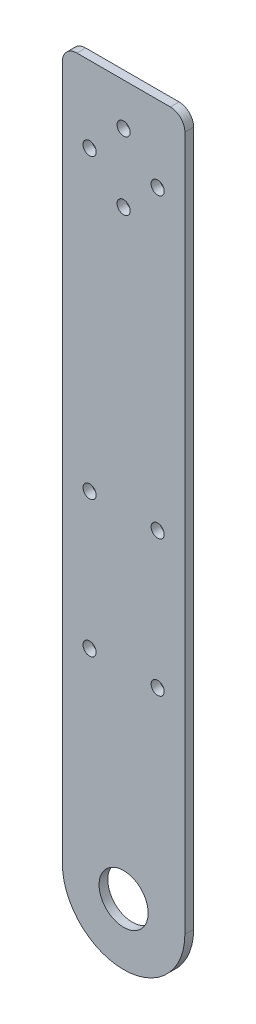
ISO-10303-21;
HEADER;
FILE_DESCRIPTION(('STEP AP214'),'2;1');
FILE_NAME('part.step','',(''),(''),'','','');
FILE_SCHEMA(('AUTOMOTIVE_DESIGN { 1 0 10303 214 1 1 1 1 }'));
ENDSEC;
DATA;
#1=APPLICATION_CONTEXT('core data for automotive mechanical design processes');
#2=APPLICATION_PROTOCOL_DEFINITION('international standard','automotive_design',2000,#1);
#3=PRODUCT_CONTEXT('',#1,'mechanical');
#4=PRODUCT('Part','Part','',(#3));
#5=PRODUCT_RELATED_PRODUCT_CATEGORY('part','',(#4));
#6=PRODUCT_DEFINITION_FORMATION('','',#4);
#7=PRODUCT_DEFINITION_CONTEXT('part definition',#1,'design');
#8=PRODUCT_DEFINITION('design','',#6,#7);
#9=PRODUCT_DEFINITION_SHAPE('','',#8);
#10=(LENGTH_UNIT() NAMED_UNIT(*) SI_UNIT(.MILLI.,.METRE.));
#11=(NAMED_UNIT(*) PLANE_ANGLE_UNIT() SI_UNIT($,.RADIAN.));
#12=(NAMED_UNIT(*) SI_UNIT($,.STERADIAN.) SOLID_ANGLE_UNIT());
#13=UNCERTAINTY_MEASURE_WITH_UNIT(LENGTH_MEASURE(1.E-05),#10,'distance_accuracy_value','');
#14=(GEOMETRIC_REPRESENTATION_CONTEXT(3) GLOBAL_UNCERTAINTY_ASSIGNED_CONTEXT((#13)) GLOBAL_UNIT_ASSIGNED_CONTEXT((#10,
#11,#12)) REPRESENTATION_CONTEXT('',''));
#15=CARTESIAN_POINT('',(0.,0.,0.));
#16=DIRECTION('',(0.,0.,1.));
#17=DIRECTION('',(1.,0.,0.));
#18=AXIS2_PLACEMENT_3D('',#15,#16,#17);
#19=CARTESIAN_POINT('',(0.,0.,1.8));
#20=DIRECTION('',(0.,0.,1.));
#21=DIRECTION('',(1.,0.,0.));
#22=AXIS2_PLACEMENT_3D('',#19,#20,#21);
#23=PLANE('',#22);
#24=CARTESIAN_POINT('',(0.,123.185826180637,1.8));
#25=DIRECTION('',(0.,0.,1.));
#26=DIRECTION('',(-1.,0.,0.));
#27=AXIS2_PLACEMENT_3D('',#24,#25,#26);
#28=CIRCLE('',#27,1.35);
#29=CARTESIAN_POINT('',(-1.35,123.185826180637,1.8));
#30=VERTEX_POINT('',#29);
#31=EDGE_CURVE('E218',#30,#30,#28,.T.);
#32=ORIENTED_EDGE('',*,*,#31,.F.);
#33=EDGE_LOOP('',(#32));
#34=FACE_BOUND('',#33,.T.);
#35=CARTESIAN_POINT('',(0.,137.185826180637,1.8));
#36=DIRECTION('',(0.,0.,1.));
#37=DIRECTION('',(1.,0.,0.));
#38=AXIS2_PLACEMENT_3D('',#35,#36,#37);
#39=CIRCLE('',#38,1.35);
#40=CARTESIAN_POINT('',(1.35,137.185826180637,1.8));
#41=VERTEX_POINT('',#40);
#42=EDGE_CURVE('E202',#41,#41,#39,.T.);
#43=ORIENTED_EDGE('',*,*,#42,.F.);
#44=EDGE_LOOP('',(#43));
#45=FACE_BOUND('',#44,.T.);
#46=CARTESIAN_POINT('',(-6.99999999999998,69.0899815954447,1.8));
#47=DIRECTION('',(0.,0.,1.));
#48=DIRECTION('',(-1.,0.,0.));
#49=AXIS2_PLACEMENT_3D('',#46,#47,#48);
#50=CIRCLE('',#49,1.35);
#51=CARTESIAN_POINT('',(-8.34999999999998,69.0899815954447,1.8));
#52=VERTEX_POINT('',#51);
#53=EDGE_CURVE('E186',#52,#52,#50,.T.);
#54=ORIENTED_EDGE('',*,*,#53,.F.);
#55=EDGE_LOOP('',(#54));
#56=FACE_BOUND('',#55,.T.);
#57=CARTESIAN_POINT('',(7.,69.0899815954447,1.8));
#58=DIRECTION('',(0.,0.,1.));
#59=DIRECTION('',(1.,0.,0.));
#60=AXIS2_PLACEMENT_3D('',#57,#58,#59);
#61=CIRCLE('',#60,1.35);
#62=CARTESIAN_POINT('',(8.35,69.0899815954447,1.8));
#63=VERTEX_POINT('',#62);
#64=EDGE_CURVE('E170',#63,#63,#61,.T.);
#65=ORIENTED_EDGE('',*,*,#64,.F.);
#66=EDGE_LOOP('',(#65));
#67=FACE_BOUND('',#66,.T.);
#68=DIRECTION('',(0.,1.,0.));
#69=VECTOR('',#68,1.);
#70=CARTESIAN_POINT('',(12.5961749377996,145.832394840701,1.8));
#71=LINE('',#70,#69);
#72=CARTESIAN_POINT('',(12.5961749377996,0.,1.8));
#73=VERTEX_POINT('',#72);
#74=CARTESIAN_POINT('',(12.5961749377996,142.832394840701,1.8));
#75=VERTEX_POINT('',#74);
#76=EDGE_CURVE('E89',#73,#75,#71,.T.);
#77=ORIENTED_EDGE('',*,*,#76,.T.);
#78=CARTESIAN_POINT('',(9.59617493779957,142.832394840701,1.8));
#79=DIRECTION('',(0.,0.,1.));
#80=DIRECTION('',(1.,0.,0.));
#81=AXIS2_PLACEMENT_3D('',#78,#79,#80);
#82=CIRCLE('',#81,3.);
#83=CARTESIAN_POINT('',(9.59617493779956,145.832394840701,1.8));
#84=VERTEX_POINT('',#83);
#85=EDGE_CURVE('E11',#75,#84,#82,.T.);
#86=ORIENTED_EDGE('',*,*,#85,.T.);
#87=DIRECTION('',(-1.,0.,0.));
#88=VECTOR('',#87,1.);
#89=CARTESIAN_POINT('',(-12.5961749377996,145.832394840701,1.8));
#90=LINE('',#89,#88);
#91=CARTESIAN_POINT('',(-9.59617493779957,145.832394840701,1.8));
#92=VERTEX_POINT('',#91);
#93=EDGE_CURVE('E98',#84,#92,#90,.T.);
#94=ORIENTED_EDGE('',*,*,#93,.T.);
#95=CARTESIAN_POINT('',(-9.59617493779957,142.832394840701,1.8));
#96=DIRECTION('',(0.,0.,1.));
#97=DIRECTION('',(1.,0.,0.));
#98=AXIS2_PLACEMENT_3D('',#95,#96,#97);
#99=CIRCLE('',#98,3.);
#100=CARTESIAN_POINT('',(-12.5961749377996,142.832394840701,1.8));
#101=VERTEX_POINT('',#100);
#102=EDGE_CURVE('E133',#92,#101,#99,.T.);
#103=ORIENTED_EDGE('',*,*,#102,.T.);
#104=DIRECTION('',(0.,-1.,0.));
#105=VECTOR('',#104,1.);
#106=CARTESIAN_POINT('',(-12.5961749377996,0.,1.8));
#107=LINE('',#106,#105);
#108=CARTESIAN_POINT('',(-12.5961749377996,0.,1.8));
#109=VERTEX_POINT('',#108);
#110=EDGE_CURVE('E104',#101,#109,#107,.T.);
#111=ORIENTED_EDGE('',*,*,#110,.T.);
#112=CARTESIAN_POINT('',(0.,0.,1.8));
#113=DIRECTION('',(0.,0.,1.));
#114=DIRECTION('',(1.,0.,0.));
#115=AXIS2_PLACEMENT_3D('',#112,#113,#114);
#116=CIRCLE('',#115,12.5961749377996);
#117=EDGE_CURVE('E99',#109,#73,#116,.T.);
#118=ORIENTED_EDGE('',*,*,#117,.T.);
#119=EDGE_LOOP('',(#77,#86,#94,#103,#111,#118));
#120=FACE_BOUND('',#119,.T.);
#121=CARTESIAN_POINT('',(7.,41.0899815954447,1.8));
#122=DIRECTION('',(0.,0.,1.));
#123=DIRECTION('',(1.,0.,0.));
#124=AXIS2_PLACEMENT_3D('',#121,#122,#123);
#125=CIRCLE('',#124,1.35);
#126=CARTESIAN_POINT('',(8.35,41.0899815954447,1.8));
#127=VERTEX_POINT('',#126);
#128=EDGE_CURVE('E161',#127,#127,#125,.T.);
#129=ORIENTED_EDGE('',*,*,#128,.F.);
#130=EDGE_LOOP('',(#129));
#131=FACE_BOUND('',#130,.T.);
#132=CARTESIAN_POINT('',(-6.99999999999998,41.0899815954447,1.8));
#133=DIRECTION('',(0.,0.,1.));
#134=DIRECTION('',(-1.,0.,0.));
#135=AXIS2_PLACEMENT_3D('',#132,#133,#134);
#136=CIRCLE('',#135,1.35);
#137=CARTESIAN_POINT('',(-8.34999999999997,41.0899815954447,1.8));
#138=VERTEX_POINT('',#137);
#139=EDGE_CURVE('E178',#138,#138,#136,.T.);
#140=ORIENTED_EDGE('',*,*,#139,.F.);
#141=EDGE_LOOP('',(#140));
#142=FACE_BOUND('',#141,.T.);
#143=CARTESIAN_POINT('',(7.,130.185826180637,1.8));
#144=DIRECTION('',(0.,0.,1.));
#145=DIRECTION('',(1.,0.,0.));
#146=AXIS2_PLACEMENT_3D('',#143,#144,#145);
#147=CIRCLE('',#146,1.35);
#148=CARTESIAN_POINT('',(8.35,130.185826180637,1.8));
#149=VERTEX_POINT('',#148);
#150=EDGE_CURVE('E194',#149,#149,#147,.T.);
#151=ORIENTED_EDGE('',*,*,#150,.F.);
#152=EDGE_LOOP('',(#151));
#153=FACE_BOUND('',#152,.T.);
#154=CARTESIAN_POINT('',(-7.,130.185826180637,1.8));
#155=DIRECTION('',(0.,0.,1.));
#156=DIRECTION('',(-1.,0.,0.));
#157=AXIS2_PLACEMENT_3D('',#154,#155,#156);
#158=CIRCLE('',#157,1.35);
#159=CARTESIAN_POINT('',(-8.35,130.185826180637,1.8));
#160=VERTEX_POINT('',#159);
#161=EDGE_CURVE('E210',#160,#160,#158,.T.);
#162=ORIENTED_EDGE('',*,*,#161,.F.);
#163=EDGE_LOOP('',(#162));
#164=FACE_BOUND('',#163,.T.);
#165=CARTESIAN_POINT('',(0.,0.,1.8));
#166=DIRECTION('',(0.,0.,1.));
#167=DIRECTION('',(1.,0.,0.));
#168=AXIS2_PLACEMENT_3D('',#165,#166,#167);
#169=CIRCLE('',#168,5.05);
#170=CARTESIAN_POINT('',(5.05,0.,1.8));
#171=VERTEX_POINT('',#170);
#172=EDGE_CURVE('E226',#171,#171,#169,.T.);
#173=ORIENTED_EDGE('',*,*,#172,.F.);
#174=EDGE_LOOP('',(#173));
#175=FACE_BOUND('',#174,.T.);
#176=ADVANCED_FACE('F39',(#34,#45,#56,#67,#120,#131,#142,#153,#164,#175),#23,.T.);
#177=CARTESIAN_POINT('',(0.,0.,0.));
#178=DIRECTION('',(0.,0.,1.));
#179=DIRECTION('',(1.,0.,0.));
#180=AXIS2_PLACEMENT_3D('',#177,#178,#179);
#181=PLANE('',#180);
#182=DIRECTION('',(-1.,0.,0.));
#183=VECTOR('',#182,1.);
#184=CARTESIAN_POINT('',(-12.5961749377996,145.832394840701,0.));
#185=LINE('',#184,#183);
#186=CARTESIAN_POINT('',(9.59617493779956,145.832394840701,0.));
#187=VERTEX_POINT('',#186);
#188=CARTESIAN_POINT('',(-9.59617493779957,145.832394840701,0.));
#189=VERTEX_POINT('',#188);
#190=EDGE_CURVE('E146',#187,#189,#185,.T.);
#191=ORIENTED_EDGE('',*,*,#190,.F.);
#192=CARTESIAN_POINT('',(9.59617493779957,142.832394840701,0.));
#193=DIRECTION('',(0.,0.,1.));
#194=DIRECTION('',(1.,0.,0.));
#195=AXIS2_PLACEMENT_3D('',#192,#193,#194);
#196=CIRCLE('',#195,3.);
#197=CARTESIAN_POINT('',(12.5961749377996,142.832394840701,0.));
#198=VERTEX_POINT('',#197);
#199=EDGE_CURVE('E62',#187,#198,#196,.F.);
#200=ORIENTED_EDGE('',*,*,#199,.T.);
#201=DIRECTION('',(0.,1.,0.));
#202=VECTOR('',#201,1.);
#203=CARTESIAN_POINT('',(12.5961749377996,145.832394840701,0.));
#204=LINE('',#203,#202);
#205=CARTESIAN_POINT('',(12.5961749377996,0.,0.));
#206=VERTEX_POINT('',#205);
#207=EDGE_CURVE('E153',#206,#198,#204,.T.);
#208=ORIENTED_EDGE('',*,*,#207,.F.);
#209=CARTESIAN_POINT('',(0.,0.,0.));
#210=DIRECTION('',(0.,0.,1.));
#211=DIRECTION('',(1.,0.,0.));
#212=AXIS2_PLACEMENT_3D('',#209,#210,#211);
#213=CIRCLE('',#212,12.5961749377996);
#214=CARTESIAN_POINT('',(-12.5961749377996,0.,0.));
#215=VERTEX_POINT('',#214);
#216=EDGE_CURVE('E113',#215,#206,#213,.T.);
#217=ORIENTED_EDGE('',*,*,#216,.F.);
#218=DIRECTION('',(0.,-1.,0.));
#219=VECTOR('',#218,1.);
#220=CARTESIAN_POINT('',(-12.5961749377996,0.,0.));
#221=LINE('',#220,#219);
#222=CARTESIAN_POINT('',(-12.5961749377996,142.832394840701,0.));
#223=VERTEX_POINT('',#222);
#224=EDGE_CURVE('E109',#223,#215,#221,.T.);
#225=ORIENTED_EDGE('',*,*,#224,.F.);
#226=CARTESIAN_POINT('',(-9.59617493779957,142.832394840701,0.));
#227=DIRECTION('',(0.,0.,1.));
#228=DIRECTION('',(1.,0.,0.));
#229=AXIS2_PLACEMENT_3D('',#226,#227,#228);
#230=CIRCLE('',#229,3.);
#231=EDGE_CURVE('E121',#223,#189,#230,.F.);
#232=ORIENTED_EDGE('',*,*,#231,.T.);
#233=EDGE_LOOP('',(#191,#200,#208,#217,#225,#232));
#234=FACE_BOUND('',#233,.T.);
#235=CARTESIAN_POINT('',(7.,41.0899815954447,0.));
#236=DIRECTION('',(0.,0.,1.));
#237=DIRECTION('',(1.,0.,0.));
#238=AXIS2_PLACEMENT_3D('',#235,#236,#237);
#239=CIRCLE('',#238,1.35);
#240=CARTESIAN_POINT('',(8.35,41.0899815954447,0.));
#241=VERTEX_POINT('',#240);
#242=EDGE_CURVE('E166',#241,#241,#239,.T.);
#243=ORIENTED_EDGE('',*,*,#242,.T.);
#244=EDGE_LOOP('',(#243));
#245=FACE_BOUND('',#244,.T.);
#246=CARTESIAN_POINT('',(7.,69.0899815954447,0.));
#247=DIRECTION('',(0.,0.,1.));
#248=DIRECTION('',(1.,0.,0.));
#249=AXIS2_PLACEMENT_3D('',#246,#247,#248);
#250=CIRCLE('',#249,1.35);
#251=CARTESIAN_POINT('',(8.35,69.0899815954447,0.));
#252=VERTEX_POINT('',#251);
#253=EDGE_CURVE('E174',#252,#252,#250,.T.);
#254=ORIENTED_EDGE('',*,*,#253,.T.);
#255=EDGE_LOOP('',(#254));
#256=FACE_BOUND('',#255,.T.);
#257=CARTESIAN_POINT('',(-6.99999999999998,41.0899815954447,0.));
#258=DIRECTION('',(0.,0.,1.));
#259=DIRECTION('',(-1.,0.,0.));
#260=AXIS2_PLACEMENT_3D('',#257,#258,#259);
#261=CIRCLE('',#260,1.35);
#262=CARTESIAN_POINT('',(-8.34999999999997,41.0899815954447,0.));
#263=VERTEX_POINT('',#262);
#264=EDGE_CURVE('E182',#263,#263,#261,.T.);
#265=ORIENTED_EDGE('',*,*,#264,.T.);
#266=EDGE_LOOP('',(#265));
#267=FACE_BOUND('',#266,.T.);
#268=CARTESIAN_POINT('',(-6.99999999999998,69.0899815954447,0.));
#269=DIRECTION('',(0.,0.,1.));
#270=DIRECTION('',(-1.,0.,0.));
#271=AXIS2_PLACEMENT_3D('',#268,#269,#270);
#272=CIRCLE('',#271,1.35);
#273=CARTESIAN_POINT('',(-8.34999999999998,69.0899815954447,0.));
#274=VERTEX_POINT('',#273);
#275=EDGE_CURVE('E190',#274,#274,#272,.T.);
#276=ORIENTED_EDGE('',*,*,#275,.T.);
#277=EDGE_LOOP('',(#276));
#278=FACE_BOUND('',#277,.T.);
#279=CARTESIAN_POINT('',(7.,130.185826180637,0.));
#280=DIRECTION('',(0.,0.,1.));
#281=DIRECTION('',(1.,0.,0.));
#282=AXIS2_PLACEMENT_3D('',#279,#280,#281);
#283=CIRCLE('',#282,1.35);
#284=CARTESIAN_POINT('',(8.35,130.185826180637,0.));
#285=VERTEX_POINT('',#284);
#286=EDGE_CURVE('E198',#285,#285,#283,.T.);
#287=ORIENTED_EDGE('',*,*,#286,.T.);
#288=EDGE_LOOP('',(#287));
#289=FACE_BOUND('',#288,.T.);
#290=CARTESIAN_POINT('',(0.,137.185826180637,0.));
#291=DIRECTION('',(0.,0.,1.));
#292=DIRECTION('',(1.,0.,0.));
#293=AXIS2_PLACEMENT_3D('',#290,#291,#292);
#294=CIRCLE('',#293,1.35);
#295=CARTESIAN_POINT('',(1.35,137.185826180637,0.));
#296=VERTEX_POINT('',#295);
#297=EDGE_CURVE('E206',#296,#296,#294,.T.);
#298=ORIENTED_EDGE('',*,*,#297,.T.);
#299=EDGE_LOOP('',(#298));
#300=FACE_BOUND('',#299,.T.);
#301=CARTESIAN_POINT('',(-7.,130.185826180637,0.));
#302=DIRECTION('',(0.,0.,1.));
#303=DIRECTION('',(-1.,0.,0.));
#304=AXIS2_PLACEMENT_3D('',#301,#302,#303);
#305=CIRCLE('',#304,1.35);
#306=CARTESIAN_POINT('',(-8.35,130.185826180637,0.));
#307=VERTEX_POINT('',#306);
#308=EDGE_CURVE('E214',#307,#307,#305,.T.);
#309=ORIENTED_EDGE('',*,*,#308,.T.);
#310=EDGE_LOOP('',(#309));
#311=FACE_BOUND('',#310,.T.);
#312=CARTESIAN_POINT('',(0.,123.185826180637,0.));
#313=DIRECTION('',(0.,0.,1.));
#314=DIRECTION('',(-1.,0.,0.));
#315=AXIS2_PLACEMENT_3D('',#312,#313,#314);
#316=CIRCLE('',#315,1.35);
#317=CARTESIAN_POINT('',(-1.35,123.185826180637,0.));
#318=VERTEX_POINT('',#317);
#319=EDGE_CURVE('E222',#318,#318,#316,.T.);
#320=ORIENTED_EDGE('',*,*,#319,.T.);
#321=EDGE_LOOP('',(#320));
#322=FACE_BOUND('',#321,.T.);
#323=CARTESIAN_POINT('',(0.,0.,0.));
#324=DIRECTION('',(0.,0.,1.));
#325=DIRECTION('',(1.,0.,0.));
#326=AXIS2_PLACEMENT_3D('',#323,#324,#325);
#327=CIRCLE('',#326,5.05);
#328=CARTESIAN_POINT('',(5.05,0.,0.));
#329=VERTEX_POINT('',#328);
#330=EDGE_CURVE('E230',#329,#329,#327,.T.);
#331=ORIENTED_EDGE('',*,*,#330,.T.);
#332=EDGE_LOOP('',(#331));
#333=FACE_BOUND('',#332,.T.);
#334=ADVANCED_FACE('F148',(#234,#245,#256,#267,#278,#289,#300,#311,#322,#333),#181,.F.);
#335=CARTESIAN_POINT('',(0.,0.,1.8));
#336=DIRECTION('',(0.,0.,-1.));
#337=DIRECTION('',(-1.,0.,0.));
#338=AXIS2_PLACEMENT_3D('',#335,#336,#337);
#339=CYLINDRICAL_SURFACE('',#338,12.5961749377996);
#340=ORIENTED_EDGE('',*,*,#216,.T.);
#341=DIRECTION('',(0.,0.,-1.));
#342=VECTOR('',#341,1.);
#343=CARTESIAN_POINT('',(12.5961749377996,0.,1.8));
#344=LINE('',#343,#342);
#345=EDGE_CURVE('E93',#73,#206,#344,.T.);
#346=ORIENTED_EDGE('',*,*,#345,.F.);
#347=ORIENTED_EDGE('',*,*,#117,.F.);
#348=DIRECTION('',(0.,0.,-1.));
#349=VECTOR('',#348,1.);
#350=CARTESIAN_POINT('',(-12.5961749377996,0.,1.8));
#351=LINE('',#350,#349);
#352=EDGE_CURVE('E116',#109,#215,#351,.T.);
#353=ORIENTED_EDGE('',*,*,#352,.T.);
#354=EDGE_LOOP('',(#340,#346,#347,#353));
#355=FACE_BOUND('',#354,.T.);
#356=ADVANCED_FACE('F111',(#355),#339,.T.);
#357=CARTESIAN_POINT('',(12.5961749377996,145.832394840701,1.8));
#358=DIRECTION('',(-1.,0.,0.));
#359=DIRECTION('',(0.,0.,1.));
#360=AXIS2_PLACEMENT_3D('',#357,#358,#359);
#361=PLANE('',#360);
#362=ORIENTED_EDGE('',*,*,#207,.T.);
#363=DIRECTION('',(0.,0.,-1.));
#364=VECTOR('',#363,1.);
#365=CARTESIAN_POINT('',(12.5961749377996,142.832394840701,1.8));
#366=LINE('',#365,#364);
#367=EDGE_CURVE('E48',#198,#75,#366,.F.);
#368=ORIENTED_EDGE('',*,*,#367,.T.);
#369=ORIENTED_EDGE('',*,*,#76,.F.);
#370=ORIENTED_EDGE('',*,*,#345,.T.);
#371=EDGE_LOOP('',(#362,#368,#369,#370));
#372=FACE_BOUND('',#371,.T.);
#373=ADVANCED_FACE('F91',(#372),#361,.F.);
#374=CARTESIAN_POINT('',(-12.5961749377996,145.832394840701,1.8));
#375=DIRECTION('',(0.,-1.,0.));
#376=DIRECTION('',(0.,0.,-1.));
#377=AXIS2_PLACEMENT_3D('',#374,#375,#376);
#378=PLANE('',#377);
#379=ORIENTED_EDGE('',*,*,#93,.F.);
#380=DIRECTION('',(0.,0.,-1.));
#381=VECTOR('',#380,1.);
#382=CARTESIAN_POINT('',(9.59617493779957,145.832394840701,1.8));
#383=LINE('',#382,#381);
#384=EDGE_CURVE('E136',#84,#187,#383,.T.);
#385=ORIENTED_EDGE('',*,*,#384,.T.);
#386=ORIENTED_EDGE('',*,*,#190,.T.);
#387=DIRECTION('',(0.,0.,-1.));
#388=VECTOR('',#387,1.);
#389=CARTESIAN_POINT('',(-9.59617493779957,145.832394840701,1.8));
#390=LINE('',#389,#388);
#391=EDGE_CURVE('E129',#189,#92,#390,.F.);
#392=ORIENTED_EDGE('',*,*,#391,.T.);
#393=EDGE_LOOP('',(#379,#385,#386,#392));
#394=FACE_BOUND('',#393,.T.);
#395=ADVANCED_FACE('F145',(#394),#378,.F.);
#396=CARTESIAN_POINT('',(-12.5961749377996,0.,1.8));
#397=DIRECTION('',(1.,0.,0.));
#398=DIRECTION('',(0.,0.,-1.));
#399=AXIS2_PLACEMENT_3D('',#396,#397,#398);
#400=PLANE('',#399);
#401=ORIENTED_EDGE('',*,*,#110,.F.);
#402=DIRECTION('',(0.,0.,-1.));
#403=VECTOR('',#402,1.);
#404=CARTESIAN_POINT('',(-12.5961749377996,142.832394840701,1.8));
#405=LINE('',#404,#403);
#406=EDGE_CURVE('E115',#101,#223,#405,.T.);
#407=ORIENTED_EDGE('',*,*,#406,.T.);
#408=ORIENTED_EDGE('',*,*,#224,.T.);
#409=ORIENTED_EDGE('',*,*,#352,.F.);
#410=EDGE_LOOP('',(#401,#407,#408,#409));
#411=FACE_BOUND('',#410,.T.);
#412=ADVANCED_FACE('F254',(#411),#400,.F.);
#413=CARTESIAN_POINT('',(7.,41.0899815954447,1.8));
#414=DIRECTION('',(0.,0.,-1.));
#415=DIRECTION('',(-1.,0.,0.));
#416=AXIS2_PLACEMENT_3D('',#413,#414,#415);
#417=CYLINDRICAL_SURFACE('',#416,1.35);
#418=ORIENTED_EDGE('',*,*,#128,.T.);
#419=EDGE_LOOP('',(#418));
#420=FACE_BOUND('',#419,.T.);
#421=ORIENTED_EDGE('',*,*,#242,.F.);
#422=EDGE_LOOP('',(#421));
#423=FACE_BOUND('',#422,.T.);
#424=ADVANCED_FACE('F251',(#420,#423),#417,.F.);
#425=CARTESIAN_POINT('',(7.,69.0899815954447,1.8));
#426=DIRECTION('',(0.,0.,-1.));
#427=DIRECTION('',(-1.,0.,0.));
#428=AXIS2_PLACEMENT_3D('',#425,#426,#427);
#429=CYLINDRICAL_SURFACE('',#428,1.35);
#430=ORIENTED_EDGE('',*,*,#64,.T.);
#431=EDGE_LOOP('',(#430));
#432=FACE_BOUND('',#431,.T.);
#433=ORIENTED_EDGE('',*,*,#253,.F.);
#434=EDGE_LOOP('',(#433));
#435=FACE_BOUND('',#434,.T.);
#436=ADVANCED_FACE('F298',(#432,#435),#429,.F.);
#437=CARTESIAN_POINT('',(-6.99999999999998,41.0899815954447,1.8));
#438=DIRECTION('',(0.,0.,-1.));
#439=DIRECTION('',(-1.,0.,0.));
#440=AXIS2_PLACEMENT_3D('',#437,#438,#439);
#441=CYLINDRICAL_SURFACE('',#440,1.35);
#442=ORIENTED_EDGE('',*,*,#139,.T.);
#443=EDGE_LOOP('',(#442));
#444=FACE_BOUND('',#443,.T.);
#445=ORIENTED_EDGE('',*,*,#264,.F.);
#446=EDGE_LOOP('',(#445));
#447=FACE_BOUND('',#446,.T.);
#448=ADVANCED_FACE('F295',(#444,#447),#441,.F.);
#449=CARTESIAN_POINT('',(-6.99999999999998,69.0899815954447,1.8));
#450=DIRECTION('',(0.,0.,-1.));
#451=DIRECTION('',(-1.,0.,0.));
#452=AXIS2_PLACEMENT_3D('',#449,#450,#451);
#453=CYLINDRICAL_SURFACE('',#452,1.35);
#454=ORIENTED_EDGE('',*,*,#53,.T.);
#455=EDGE_LOOP('',(#454));
#456=FACE_BOUND('',#455,.T.);
#457=ORIENTED_EDGE('',*,*,#275,.F.);
#458=EDGE_LOOP('',(#457));
#459=FACE_BOUND('',#458,.T.);
#460=ADVANCED_FACE('F291',(#456,#459),#453,.F.);
#461=CARTESIAN_POINT('',(7.,130.185826180637,1.8));
#462=DIRECTION('',(0.,0.,-1.));
#463=DIRECTION('',(-1.,0.,0.));
#464=AXIS2_PLACEMENT_3D('',#461,#462,#463);
#465=CYLINDRICAL_SURFACE('',#464,1.35);
#466=ORIENTED_EDGE('',*,*,#150,.T.);
#467=EDGE_LOOP('',(#466));
#468=FACE_BOUND('',#467,.T.);
#469=ORIENTED_EDGE('',*,*,#286,.F.);
#470=EDGE_LOOP('',(#469));
#471=FACE_BOUND('',#470,.T.);
#472=ADVANCED_FACE('F287',(#468,#471),#465,.F.);
#473=CARTESIAN_POINT('',(0.,137.185826180637,1.8));
#474=DIRECTION('',(0.,0.,-1.));
#475=DIRECTION('',(-1.,0.,0.));
#476=AXIS2_PLACEMENT_3D('',#473,#474,#475);
#477=CYLINDRICAL_SURFACE('',#476,1.35);
#478=ORIENTED_EDGE('',*,*,#42,.T.);
#479=EDGE_LOOP('',(#478));
#480=FACE_BOUND('',#479,.T.);
#481=ORIENTED_EDGE('',*,*,#297,.F.);
#482=EDGE_LOOP('',(#481));
#483=FACE_BOUND('',#482,.T.);
#484=ADVANCED_FACE('F283',(#480,#483),#477,.F.);
#485=CARTESIAN_POINT('',(-7.,130.185826180637,1.8));
#486=DIRECTION('',(0.,0.,-1.));
#487=DIRECTION('',(-1.,0.,0.));
#488=AXIS2_PLACEMENT_3D('',#485,#486,#487);
#489=CYLINDRICAL_SURFACE('',#488,1.35);
#490=ORIENTED_EDGE('',*,*,#161,.T.);
#491=EDGE_LOOP('',(#490));
#492=FACE_BOUND('',#491,.T.);
#493=ORIENTED_EDGE('',*,*,#308,.F.);
#494=EDGE_LOOP('',(#493));
#495=FACE_BOUND('',#494,.T.);
#496=ADVANCED_FACE('F277',(#492,#495),#489,.F.);
#497=CARTESIAN_POINT('',(0.,123.185826180637,1.8));
#498=DIRECTION('',(0.,0.,-1.));
#499=DIRECTION('',(-1.,0.,0.));
#500=AXIS2_PLACEMENT_3D('',#497,#498,#499);
#501=CYLINDRICAL_SURFACE('',#500,1.35);
#502=ORIENTED_EDGE('',*,*,#31,.T.);
#503=EDGE_LOOP('',(#502));
#504=FACE_BOUND('',#503,.T.);
#505=ORIENTED_EDGE('',*,*,#319,.F.);
#506=EDGE_LOOP('',(#505));
#507=FACE_BOUND('',#506,.T.);
#508=ADVANCED_FACE('F270',(#504,#507),#501,.F.);
#509=CARTESIAN_POINT('',(0.,0.,1.8));
#510=DIRECTION('',(0.,0.,-1.));
#511=DIRECTION('',(-1.,0.,0.));
#512=AXIS2_PLACEMENT_3D('',#509,#510,#511);
#513=CYLINDRICAL_SURFACE('',#512,5.05);
#514=ORIENTED_EDGE('',*,*,#172,.T.);
#515=EDGE_LOOP('',(#514));
#516=FACE_BOUND('',#515,.T.);
#517=ORIENTED_EDGE('',*,*,#330,.F.);
#518=EDGE_LOOP('',(#517));
#519=FACE_BOUND('',#518,.T.);
#520=ADVANCED_FACE('F238',(#516,#519),#513,.F.);
#521=CARTESIAN_POINT('',(-9.59617493779957,142.832394840701,1.8));
#522=DIRECTION('',(0.,0.,-1.));
#523=DIRECTION('',(-1.,0.,0.));
#524=AXIS2_PLACEMENT_3D('',#521,#522,#523);
#525=CYLINDRICAL_SURFACE('',#524,3.);
#526=ORIENTED_EDGE('',*,*,#102,.F.);
#527=ORIENTED_EDGE('',*,*,#391,.F.);
#528=ORIENTED_EDGE('',*,*,#231,.F.);
#529=ORIENTED_EDGE('',*,*,#406,.F.);
#530=EDGE_LOOP('',(#526,#527,#528,#529));
#531=FACE_BOUND('',#530,.T.);
#532=ADVANCED_FACE('F263',(#531),#525,.T.);
#533=CARTESIAN_POINT('',(9.59617493779957,142.832394840701,1.8));
#534=DIRECTION('',(0.,0.,-1.));
#535=DIRECTION('',(-1.,0.,0.));
#536=AXIS2_PLACEMENT_3D('',#533,#534,#535);
#537=CYLINDRICAL_SURFACE('',#536,3.);
#538=ORIENTED_EDGE('',*,*,#85,.F.);
#539=ORIENTED_EDGE('',*,*,#367,.F.);
#540=ORIENTED_EDGE('',*,*,#199,.F.);
#541=ORIENTED_EDGE('',*,*,#384,.F.);
#542=EDGE_LOOP('',(#538,#539,#540,#541));
#543=FACE_BOUND('',#542,.T.);
#544=ADVANCED_FACE('F41',(#543),#537,.T.);
#545=CLOSED_SHELL('',(#176,#334,#356,#373,#395,#412,#424,#436,#448,#460,#472,#484,#496,#508,
#520,#532,#544));
#546=MANIFOLD_SOLID_BREP('B2',#545);
#547=ADVANCED_BREP_SHAPE_REPRESENTATION('',(#18,#546),#14);
#548=SHAPE_DEFINITION_REPRESENTATION(#9,#547);
ENDSEC;
END-ISO-10303-21;
